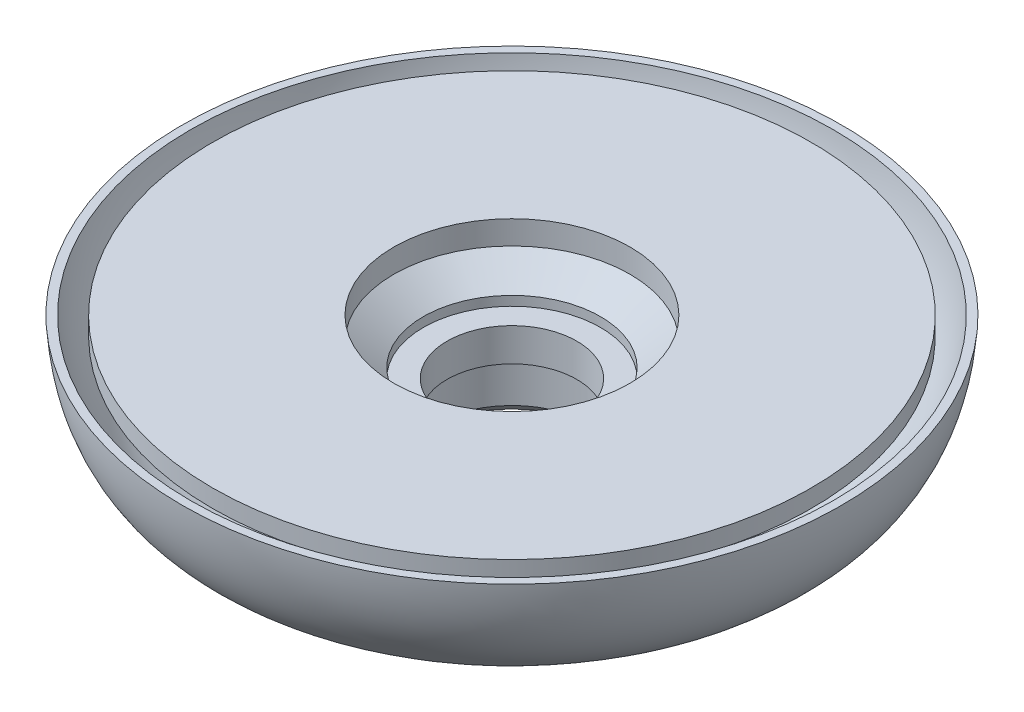
ISO-10303-21;
HEADER;
FILE_DESCRIPTION(('STEP AP214'),'2;1');
FILE_NAME('part.step','',(''),(''),'','','');
FILE_SCHEMA(('AUTOMOTIVE_DESIGN { 1 0 10303 214 1 1 1 1 }'));
ENDSEC;
DATA;
#1=APPLICATION_CONTEXT('core data for automotive mechanical design processes');
#2=APPLICATION_PROTOCOL_DEFINITION('international standard','automotive_design',2000,#1);
#3=PRODUCT_CONTEXT('',#1,'mechanical');
#4=PRODUCT('Part','Part','',(#3));
#5=PRODUCT_RELATED_PRODUCT_CATEGORY('part','',(#4));
#6=PRODUCT_DEFINITION_FORMATION('','',#4);
#7=PRODUCT_DEFINITION_CONTEXT('part definition',#1,'design');
#8=PRODUCT_DEFINITION('design','',#6,#7);
#9=PRODUCT_DEFINITION_SHAPE('','',#8);
#10=(LENGTH_UNIT() NAMED_UNIT(*) SI_UNIT(.MILLI.,.METRE.));
#11=(NAMED_UNIT(*) PLANE_ANGLE_UNIT() SI_UNIT($,.RADIAN.));
#12=(NAMED_UNIT(*) SI_UNIT($,.STERADIAN.) SOLID_ANGLE_UNIT());
#13=UNCERTAINTY_MEASURE_WITH_UNIT(LENGTH_MEASURE(1.E-05),#10,'distance_accuracy_value','');
#14=(GEOMETRIC_REPRESENTATION_CONTEXT(3) GLOBAL_UNCERTAINTY_ASSIGNED_CONTEXT((#13)) GLOBAL_UNIT_ASSIGNED_CONTEXT((#10,
#11,#12)) REPRESENTATION_CONTEXT('',''));
#15=CARTESIAN_POINT('',(0.,0.,0.));
#16=DIRECTION('',(0.,0.,1.));
#17=DIRECTION('',(1.,0.,0.));
#18=AXIS2_PLACEMENT_3D('',#15,#16,#17);
#19=CARTESIAN_POINT('',(-24.,5.20708281369536,0.));
#20=CARTESIAN_POINT('',(-23.3620642138231,-4.25200531190513,0.));
#21=CARTESIAN_POINT('',(-13.4914904524435,-4.51262473815966,0.));
#22=B_SPLINE_CURVE_WITH_KNOTS('',2,(#19,#20,#21),.UNSPECIFIED.,.F.,.F.,(3,3),(0.,1.),.UNSPECIFIED.);
#23=CARTESIAN_POINT('',(0.,24.5223538498266,0.));
#24=DIRECTION('',(0.,1.,0.));
#25=AXIS1_PLACEMENT('',#23,#24);
#26=SURFACE_OF_REVOLUTION('',#22,#25);
#27=CARTESIAN_POINT('',(0.,-4.51262473815966,0.));
#28=DIRECTION('',(0.,1.,0.));
#29=DIRECTION('',(0.,0.,1.));
#30=AXIS2_PLACEMENT_3D('',#27,#28,#29);
#31=CIRCLE('',#30,13.4914904524435);
#32=CARTESIAN_POINT('',(0.,-4.51262473815966,13.4914904524435));
#33=VERTEX_POINT('',#32);
#34=EDGE_CURVE('E100',#33,#33,#31,.T.);
#35=ORIENTED_EDGE('',*,*,#34,.T.);
#36=EDGE_LOOP('',(#35));
#37=FACE_BOUND('',#36,.T.);
#38=CARTESIAN_POINT('',(0.,5.20708281369536,0.));
#39=DIRECTION('',(0.,1.,0.));
#40=DIRECTION('',(0.,0.,1.));
#41=AXIS2_PLACEMENT_3D('',#38,#39,#40);
#42=CIRCLE('',#41,24.);
#43=CARTESIAN_POINT('',(0.,5.20708281369536,24.));
#44=VERTEX_POINT('',#43);
#45=EDGE_CURVE('E10',#44,#44,#42,.T.);
#46=ORIENTED_EDGE('',*,*,#45,.F.);
#47=EDGE_LOOP('',(#46));
#48=FACE_BOUND('',#47,.T.);
#49=ADVANCED_FACE('F35',(#37,#48),#26,.F.);
#50=CARTESIAN_POINT('',(-24.,5.20708281369536,0.));
#51=DIRECTION('',(0.,1.,0.));
#52=DIRECTION('',(0.,0.,1.));
#53=AXIS2_PLACEMENT_3D('',#50,#51,#52);
#54=PLANE('',#53);
#55=ORIENTED_EDGE('',*,*,#45,.T.);
#56=EDGE_LOOP('',(#55));
#57=FACE_BOUND('',#56,.T.);
#58=CARTESIAN_POINT('',(0.,5.20708281369536,0.));
#59=DIRECTION('',(0.,1.,0.));
#60=DIRECTION('',(0.,0.,1.));
#61=AXIS2_PLACEMENT_3D('',#58,#59,#60);
#62=CIRCLE('',#61,23.4);
#63=CARTESIAN_POINT('',(0.,5.20708281369536,23.4));
#64=VERTEX_POINT('',#63);
#65=EDGE_CURVE('E42',#64,#64,#62,.T.);
#66=ORIENTED_EDGE('',*,*,#65,.F.);
#67=EDGE_LOOP('',(#66));
#68=FACE_BOUND('',#67,.T.);
#69=ADVANCED_FACE('F117',(#57,#68),#54,.T.);
#70=CARTESIAN_POINT('',(-12.6169404254196,-3.91262473815966,0.));
#71=CARTESIAN_POINT('',(-22.0848929449554,-3.91810242080956,0.));
#72=CARTESIAN_POINT('',(-23.4,5.20708281369536,0.));
#73=B_SPLINE_CURVE_WITH_KNOTS('',2,(#70,#71,#72),.UNSPECIFIED.,.F.,.F.,(3,3),(0.,1.),.UNSPECIFIED.);
#74=CARTESIAN_POINT('',(0.,24.5223538498266,0.));
#75=DIRECTION('',(0.,1.,0.));
#76=AXIS1_PLACEMENT('',#74,#75);
#77=SURFACE_OF_REVOLUTION('',#73,#76);
#78=ORIENTED_EDGE('',*,*,#65,.T.);
#79=EDGE_LOOP('',(#78));
#80=FACE_BOUND('',#79,.T.);
#81=CARTESIAN_POINT('',(0.,-3.91262473815965,0.));
#82=DIRECTION('',(0.,1.,0.));
#83=DIRECTION('',(0.,0.,1.));
#84=AXIS2_PLACEMENT_3D('',#81,#82,#83);
#85=CIRCLE('',#84,12.6169404254196);
#86=CARTESIAN_POINT('',(0.,-3.91262473815965,12.6169404254196));
#87=VERTEX_POINT('',#86);
#88=EDGE_CURVE('E46',#87,#87,#85,.T.);
#89=ORIENTED_EDGE('',*,*,#88,.F.);
#90=EDGE_LOOP('',(#89));
#91=FACE_BOUND('',#90,.T.);
#92=ADVANCED_FACE('F113',(#80,#91),#77,.F.);
#93=CARTESIAN_POINT('',(-12.6169404254196,-3.91262473815966,0.));
#94=DIRECTION('',(0.,1.,0.));
#95=DIRECTION('',(0.,0.,1.));
#96=AXIS2_PLACEMENT_3D('',#93,#94,#95);
#97=PLANE('',#96);
#98=ORIENTED_EDGE('',*,*,#88,.T.);
#99=EDGE_LOOP('',(#98));
#100=FACE_BOUND('',#99,.T.);
#101=CARTESIAN_POINT('',(0.,-3.91262473815965,0.));
#102=DIRECTION('',(0.,1.,0.));
#103=DIRECTION('',(0.,0.,1.));
#104=AXIS2_PLACEMENT_3D('',#101,#102,#103);
#105=CIRCLE('',#104,11.);
#106=CARTESIAN_POINT('',(0.,-3.91262473815965,11.));
#107=VERTEX_POINT('',#106);
#108=EDGE_CURVE('E50',#107,#107,#105,.T.);
#109=ORIENTED_EDGE('',*,*,#108,.F.);
#110=EDGE_LOOP('',(#109));
#111=FACE_BOUND('',#110,.T.);
#112=ADVANCED_FACE('F116',(#100,#111),#97,.T.);
#113=CARTESIAN_POINT('',(0.,24.5223538498266,0.));
#114=DIRECTION('',(0.,1.,0.));
#115=DIRECTION('',(0.,0.,1.));
#116=AXIS2_PLACEMENT_3D('',#113,#114,#115);
#117=CYLINDRICAL_SURFACE('',#116,11.);
#118=ORIENTED_EDGE('',*,*,#108,.T.);
#119=EDGE_LOOP('',(#118));
#120=FACE_BOUND('',#119,.T.);
#121=CARTESIAN_POINT('',(0.,3.90708281369536,0.));
#122=DIRECTION('',(0.,1.,0.));
#123=DIRECTION('',(0.,0.,1.));
#124=AXIS2_PLACEMENT_3D('',#121,#122,#123);
#125=CIRCLE('',#124,11.);
#126=CARTESIAN_POINT('',(0.,3.90708281369536,11.));
#127=VERTEX_POINT('',#126);
#128=EDGE_CURVE('E55',#127,#127,#125,.T.);
#129=ORIENTED_EDGE('',*,*,#128,.F.);
#130=EDGE_LOOP('',(#129));
#131=FACE_BOUND('',#130,.T.);
#132=ADVANCED_FACE('F191',(#120,#131),#117,.T.);
#133=CARTESIAN_POINT('',(-21.8,3.90708281369536,0.));
#134=DIRECTION('',(0.,-1.,0.));
#135=DIRECTION('',(0.,0.,-1.));
#136=AXIS2_PLACEMENT_3D('',#133,#134,#135);
#137=PLANE('',#136);
#138=ORIENTED_EDGE('',*,*,#128,.T.);
#139=EDGE_LOOP('',(#138));
#140=FACE_BOUND('',#139,.T.);
#141=CARTESIAN_POINT('',(0.,3.90708281369536,0.));
#142=DIRECTION('',(0.,1.,0.));
#143=DIRECTION('',(0.,0.,1.));
#144=AXIS2_PLACEMENT_3D('',#141,#142,#143);
#145=CIRCLE('',#144,21.8);
#146=CARTESIAN_POINT('',(0.,3.90708281369536,21.8));
#147=VERTEX_POINT('',#146);
#148=EDGE_CURVE('E58',#147,#147,#145,.T.);
#149=ORIENTED_EDGE('',*,*,#148,.F.);
#150=EDGE_LOOP('',(#149));
#151=FACE_BOUND('',#150,.T.);
#152=ADVANCED_FACE('F188',(#140,#151),#137,.T.);
#153=CARTESIAN_POINT('',(0.,24.5223538498266,0.));
#154=DIRECTION('',(0.,1.,0.));
#155=DIRECTION('',(0.,0.,1.));
#156=AXIS2_PLACEMENT_3D('',#153,#154,#155);
#157=CYLINDRICAL_SURFACE('',#156,21.8);
#158=ORIENTED_EDGE('',*,*,#148,.T.);
#159=EDGE_LOOP('',(#158));
#160=FACE_BOUND('',#159,.T.);
#161=CARTESIAN_POINT('',(0.,5.20708281369536,0.));
#162=DIRECTION('',(0.,1.,0.));
#163=DIRECTION('',(0.,0.,1.));
#164=AXIS2_PLACEMENT_3D('',#161,#162,#163);
#165=CIRCLE('',#164,21.8);
#166=CARTESIAN_POINT('',(0.,5.20708281369536,21.8));
#167=VERTEX_POINT('',#166);
#168=EDGE_CURVE('E61',#167,#167,#165,.T.);
#169=ORIENTED_EDGE('',*,*,#168,.F.);
#170=EDGE_LOOP('',(#169));
#171=FACE_BOUND('',#170,.T.);
#172=ADVANCED_FACE('F184',(#160,#171),#157,.T.);
#173=CARTESIAN_POINT('',(-21.8,5.20708281369536,0.));
#174=DIRECTION('',(0.,1.,0.));
#175=DIRECTION('',(0.,0.,1.));
#176=AXIS2_PLACEMENT_3D('',#173,#174,#175);
#177=PLANE('',#176);
#178=ORIENTED_EDGE('',*,*,#168,.T.);
#179=EDGE_LOOP('',(#178));
#180=FACE_BOUND('',#179,.T.);
#181=CARTESIAN_POINT('',(0.,5.20708281369536,0.));
#182=DIRECTION('',(0.,1.,0.));
#183=DIRECTION('',(0.,0.,1.));
#184=AXIS2_PLACEMENT_3D('',#181,#182,#183);
#185=CIRCLE('',#184,8.6);
#186=CARTESIAN_POINT('',(0.,5.20708281369536,8.6));
#187=VERTEX_POINT('',#186);
#188=EDGE_CURVE('E64',#187,#187,#185,.T.);
#189=ORIENTED_EDGE('',*,*,#188,.F.);
#190=EDGE_LOOP('',(#189));
#191=FACE_BOUND('',#190,.T.);
#192=ADVANCED_FACE('F180',(#180,#191),#177,.T.);
#193=CARTESIAN_POINT('',(0.,24.5223538498266,0.));
#194=DIRECTION('',(0.,1.,0.));
#195=DIRECTION('',(0.,0.,1.));
#196=AXIS2_PLACEMENT_3D('',#193,#194,#195);
#197=CYLINDRICAL_SURFACE('',#196,8.6);
#198=ORIENTED_EDGE('',*,*,#188,.T.);
#199=EDGE_LOOP('',(#198));
#200=FACE_BOUND('',#199,.T.);
#201=CARTESIAN_POINT('',(0.,3.48771678769647,0.));
#202=DIRECTION('',(0.,1.,0.));
#203=DIRECTION('',(0.,0.,1.));
#204=AXIS2_PLACEMENT_3D('',#201,#202,#203);
#205=CIRCLE('',#204,8.6);
#206=CARTESIAN_POINT('',(0.,3.48771678769647,8.6));
#207=VERTEX_POINT('',#206);
#208=EDGE_CURVE('E67',#207,#207,#205,.T.);
#209=ORIENTED_EDGE('',*,*,#208,.F.);
#210=EDGE_LOOP('',(#209));
#211=FACE_BOUND('',#210,.T.);
#212=ADVANCED_FACE('F176',(#200,#211),#197,.F.);
#213=CARTESIAN_POINT('',(0.,1.8931953723601,0.));
#214=DIRECTION('',(0.,1.,0.));
#215=DIRECTION('',(0.,0.,1.));
#216=AXIS2_PLACEMENT_3D('',#213,#214,#215);
#217=CONICAL_SURFACE('',#216,6.45,0.932668498633308);
#218=ORIENTED_EDGE('',*,*,#208,.T.);
#219=EDGE_LOOP('',(#218));
#220=FACE_BOUND('',#219,.T.);
#221=CARTESIAN_POINT('',(0.,1.8931953723601,0.));
#222=DIRECTION('',(0.,1.,0.));
#223=DIRECTION('',(0.,0.,1.));
#224=AXIS2_PLACEMENT_3D('',#221,#222,#223);
#225=CIRCLE('',#224,6.45);
#226=CARTESIAN_POINT('',(0.,1.8931953723601,6.45));
#227=VERTEX_POINT('',#226);
#228=EDGE_CURVE('E70',#227,#227,#225,.T.);
#229=ORIENTED_EDGE('',*,*,#228,.F.);
#230=EDGE_LOOP('',(#229));
#231=FACE_BOUND('',#230,.T.);
#232=ADVANCED_FACE('F172',(#220,#231),#217,.F.);
#233=CARTESIAN_POINT('',(0.,24.5223538498266,0.));
#234=DIRECTION('',(0.,1.,0.));
#235=DIRECTION('',(0.,0.,1.));
#236=AXIS2_PLACEMENT_3D('',#233,#234,#235);
#237=CYLINDRICAL_SURFACE('',#236,6.45);
#238=ORIENTED_EDGE('',*,*,#228,.T.);
#239=EDGE_LOOP('',(#238));
#240=FACE_BOUND('',#239,.T.);
#241=CARTESIAN_POINT('',(0.,1.20708281369537,0.));
#242=DIRECTION('',(0.,1.,0.));
#243=DIRECTION('',(0.,0.,1.));
#244=AXIS2_PLACEMENT_3D('',#241,#242,#243);
#245=CIRCLE('',#244,6.45);
#246=CARTESIAN_POINT('',(0.,1.20708281369537,6.45));
#247=VERTEX_POINT('',#246);
#248=EDGE_CURVE('E73',#247,#247,#245,.T.);
#249=ORIENTED_EDGE('',*,*,#248,.F.);
#250=EDGE_LOOP('',(#249));
#251=FACE_BOUND('',#250,.T.);
#252=ADVANCED_FACE('F168',(#240,#251),#237,.F.);
#253=CARTESIAN_POINT('',(-6.45,1.20708281369536,0.));
#254=DIRECTION('',(0.,1.,0.));
#255=DIRECTION('',(0.,0.,1.));
#256=AXIS2_PLACEMENT_3D('',#253,#254,#255);
#257=PLANE('',#256);
#258=ORIENTED_EDGE('',*,*,#248,.T.);
#259=EDGE_LOOP('',(#258));
#260=FACE_BOUND('',#259,.T.);
#261=CARTESIAN_POINT('',(0.,1.20708281369537,0.));
#262=DIRECTION('',(0.,1.,0.));
#263=DIRECTION('',(0.,0.,1.));
#264=AXIS2_PLACEMENT_3D('',#261,#262,#263);
#265=CIRCLE('',#264,4.725);
#266=CARTESIAN_POINT('',(0.,1.20708281369537,4.725));
#267=VERTEX_POINT('',#266);
#268=EDGE_CURVE('E76',#267,#267,#265,.T.);
#269=ORIENTED_EDGE('',*,*,#268,.F.);
#270=EDGE_LOOP('',(#269));
#271=FACE_BOUND('',#270,.T.);
#272=ADVANCED_FACE('F164',(#260,#271),#257,.T.);
#273=CARTESIAN_POINT('',(0.,24.5223538498266,0.));
#274=DIRECTION('',(0.,1.,0.));
#275=DIRECTION('',(0.,0.,1.));
#276=AXIS2_PLACEMENT_3D('',#273,#274,#275);
#277=CYLINDRICAL_SURFACE('',#276,4.725);
#278=ORIENTED_EDGE('',*,*,#268,.T.);
#279=EDGE_LOOP('',(#278));
#280=FACE_BOUND('',#279,.T.);
#281=CARTESIAN_POINT('',(0.,-1.20708281369537,0.));
#282=DIRECTION('',(0.,1.,0.));
#283=DIRECTION('',(0.,0.,1.));
#284=AXIS2_PLACEMENT_3D('',#281,#282,#283);
#285=CIRCLE('',#284,4.725);
#286=CARTESIAN_POINT('',(0.,-1.20708281369537,4.725));
#287=VERTEX_POINT('',#286);
#288=EDGE_CURVE('E79',#287,#287,#285,.T.);
#289=ORIENTED_EDGE('',*,*,#288,.F.);
#290=EDGE_LOOP('',(#289));
#291=FACE_BOUND('',#290,.T.);
#292=ADVANCED_FACE('F160',(#280,#291),#277,.F.);
#293=CARTESIAN_POINT('',(-4.725,-1.20708281369536,0.));
#294=DIRECTION('',(0.,-1.,0.));
#295=DIRECTION('',(0.,0.,-1.));
#296=AXIS2_PLACEMENT_3D('',#293,#294,#295);
#297=PLANE('',#296);
#298=ORIENTED_EDGE('',*,*,#288,.T.);
#299=EDGE_LOOP('',(#298));
#300=FACE_BOUND('',#299,.T.);
#301=CARTESIAN_POINT('',(0.,-1.20708281369537,0.));
#302=DIRECTION('',(0.,1.,0.));
#303=DIRECTION('',(0.,0.,1.));
#304=AXIS2_PLACEMENT_3D('',#301,#302,#303);
#305=CIRCLE('',#304,5.79219351697105);
#306=CARTESIAN_POINT('',(0.,-1.20708281369537,5.79219351697105));
#307=VERTEX_POINT('',#306);
#308=EDGE_CURVE('E82',#307,#307,#305,.T.);
#309=ORIENTED_EDGE('',*,*,#308,.F.);
#310=EDGE_LOOP('',(#309));
#311=FACE_BOUND('',#310,.T.);
#312=ADVANCED_FACE('F156',(#300,#311),#297,.T.);
#313=CARTESIAN_POINT('',(0.,24.5223538498266,0.));
#314=DIRECTION('',(0.,1.,0.));
#315=DIRECTION('',(0.,0.,1.));
#316=AXIS2_PLACEMENT_3D('',#313,#314,#315);
#317=CYLINDRICAL_SURFACE('',#316,5.79219351697105);
#318=ORIENTED_EDGE('',*,*,#308,.T.);
#319=EDGE_LOOP('',(#318));
#320=FACE_BOUND('',#319,.T.);
#321=CARTESIAN_POINT('',(0.,-4.58565460985277,0.));
#322=DIRECTION('',(0.,1.,0.));
#323=DIRECTION('',(0.,0.,1.));
#324=AXIS2_PLACEMENT_3D('',#321,#322,#323);
#325=CIRCLE('',#324,5.79219351697105);
#326=CARTESIAN_POINT('',(0.,-4.58565460985277,5.79219351697105));
#327=VERTEX_POINT('',#326);
#328=EDGE_CURVE('E85',#327,#327,#325,.T.);
#329=ORIENTED_EDGE('',*,*,#328,.F.);
#330=EDGE_LOOP('',(#329));
#331=FACE_BOUND('',#330,.T.);
#332=ADVANCED_FACE('F152',(#320,#331),#317,.F.);
#333=CARTESIAN_POINT('',(0.,-5.69291718630463,0.));
#334=DIRECTION('',(0.,-1.,0.));
#335=DIRECTION('',(0.,0.,-1.));
#336=AXIS2_PLACEMENT_3D('',#333,#334,#335);
#337=CONICAL_SURFACE('',#336,7.03934654939191,0.844744603963118);
#338=ORIENTED_EDGE('',*,*,#328,.T.);
#339=EDGE_LOOP('',(#338));
#340=FACE_BOUND('',#339,.T.);
#341=CARTESIAN_POINT('',(0.,-5.69291718630463,0.));
#342=DIRECTION('',(0.,1.,0.));
#343=DIRECTION('',(0.,0.,1.));
#344=AXIS2_PLACEMENT_3D('',#341,#342,#343);
#345=CIRCLE('',#344,7.03934654939191);
#346=CARTESIAN_POINT('',(0.,-5.69291718630463,7.03934654939191));
#347=VERTEX_POINT('',#346);
#348=EDGE_CURVE('E88',#347,#347,#345,.T.);
#349=ORIENTED_EDGE('',*,*,#348,.F.);
#350=EDGE_LOOP('',(#349));
#351=FACE_BOUND('',#350,.T.);
#352=ADVANCED_FACE('F148',(#340,#351),#337,.F.);
#353=CARTESIAN_POINT('',(-7.03934654939191,-5.69291718630463,0.));
#354=DIRECTION('',(0.,-1.,0.));
#355=DIRECTION('',(0.,0.,-1.));
#356=AXIS2_PLACEMENT_3D('',#353,#354,#355);
#357=PLANE('',#356);
#358=ORIENTED_EDGE('',*,*,#348,.T.);
#359=EDGE_LOOP('',(#358));
#360=FACE_BOUND('',#359,.T.);
#361=CARTESIAN_POINT('',(0.,-5.69291718630464,0.));
#362=DIRECTION('',(0.,1.,0.));
#363=DIRECTION('',(0.,0.,1.));
#364=AXIS2_PLACEMENT_3D('',#361,#362,#363);
#365=CIRCLE('',#364,8.00935446349703);
#366=CARTESIAN_POINT('',(0.,-5.69291718630464,8.00935446349703));
#367=VERTEX_POINT('',#366);
#368=EDGE_CURVE('E91',#367,#367,#365,.T.);
#369=ORIENTED_EDGE('',*,*,#368,.F.);
#370=EDGE_LOOP('',(#369));
#371=FACE_BOUND('',#370,.T.);
#372=ADVANCED_FACE('F144',(#360,#371),#357,.T.);
#373=CARTESIAN_POINT('',(0.,24.5223538498266,0.));
#374=DIRECTION('',(0.,1.,0.));
#375=DIRECTION('',(0.,0.,1.));
#376=AXIS2_PLACEMENT_3D('',#373,#374,#375);
#377=CYLINDRICAL_SURFACE('',#376,8.00935446349703);
#378=ORIENTED_EDGE('',*,*,#368,.T.);
#379=EDGE_LOOP('',(#378));
#380=FACE_BOUND('',#379,.T.);
#381=CARTESIAN_POINT('',(0.,-4.92233205710595,0.));
#382=DIRECTION('',(0.,1.,0.));
#383=DIRECTION('',(0.,0.,1.));
#384=AXIS2_PLACEMENT_3D('',#381,#382,#383);
#385=CIRCLE('',#384,8.00935446349703);
#386=CARTESIAN_POINT('',(0.,-4.92233205710595,8.00935446349703));
#387=VERTEX_POINT('',#386);
#388=EDGE_CURVE('E94',#387,#387,#385,.T.);
#389=ORIENTED_EDGE('',*,*,#388,.F.);
#390=EDGE_LOOP('',(#389));
#391=FACE_BOUND('',#390,.T.);
#392=ADVANCED_FACE('F138',(#380,#391),#377,.T.);
#393=CARTESIAN_POINT('',(0.,-4.51262473815966,0.));
#394=DIRECTION('',(0.,-1.,0.));
#395=DIRECTION('',(0.,0.,-1.));
#396=AXIS2_PLACEMENT_3D('',#393,#394,#395);
#397=CONICAL_SURFACE('',#396,7.48416786297028,0.908296910821793);
#398=ORIENTED_EDGE('',*,*,#388,.T.);
#399=EDGE_LOOP('',(#398));
#400=FACE_BOUND('',#399,.T.);
#401=CARTESIAN_POINT('',(0.,-4.51262473815966,0.));
#402=DIRECTION('',(0.,1.,0.));
#403=DIRECTION('',(0.,0.,1.));
#404=AXIS2_PLACEMENT_3D('',#401,#402,#403);
#405=CIRCLE('',#404,7.48416786297028);
#406=CARTESIAN_POINT('',(0.,-4.51262473815966,7.48416786297028));
#407=VERTEX_POINT('',#406);
#408=EDGE_CURVE('E97',#407,#407,#405,.T.);
#409=ORIENTED_EDGE('',*,*,#408,.F.);
#410=EDGE_LOOP('',(#409));
#411=FACE_BOUND('',#410,.T.);
#412=ADVANCED_FACE('F132',(#400,#411),#397,.T.);
#413=CARTESIAN_POINT('',(-7.48416786297028,-4.51262473815966,0.));
#414=DIRECTION('',(0.,-1.,0.));
#415=DIRECTION('',(0.,0.,-1.));
#416=AXIS2_PLACEMENT_3D('',#413,#414,#415);
#417=PLANE('',#416);
#418=ORIENTED_EDGE('',*,*,#408,.T.);
#419=EDGE_LOOP('',(#418));
#420=FACE_BOUND('',#419,.T.);
#421=ORIENTED_EDGE('',*,*,#34,.F.);
#422=EDGE_LOOP('',(#421));
#423=FACE_BOUND('',#422,.T.);
#424=ADVANCED_FACE('F130',(#420,#423),#417,.T.);
#425=CLOSED_SHELL('',(#49,#69,#92,#112,#132,#152,#172,#192,#212,#232,#252,#272,#292,#312,#332,
#352,#372,#392,#412,#424));
#426=MANIFOLD_SOLID_BREP('B2',#425);
#427=ADVANCED_BREP_SHAPE_REPRESENTATION('',(#18,#426),#14);
#428=SHAPE_DEFINITION_REPRESENTATION(#9,#427);
ENDSEC;
END-ISO-10303-21;
